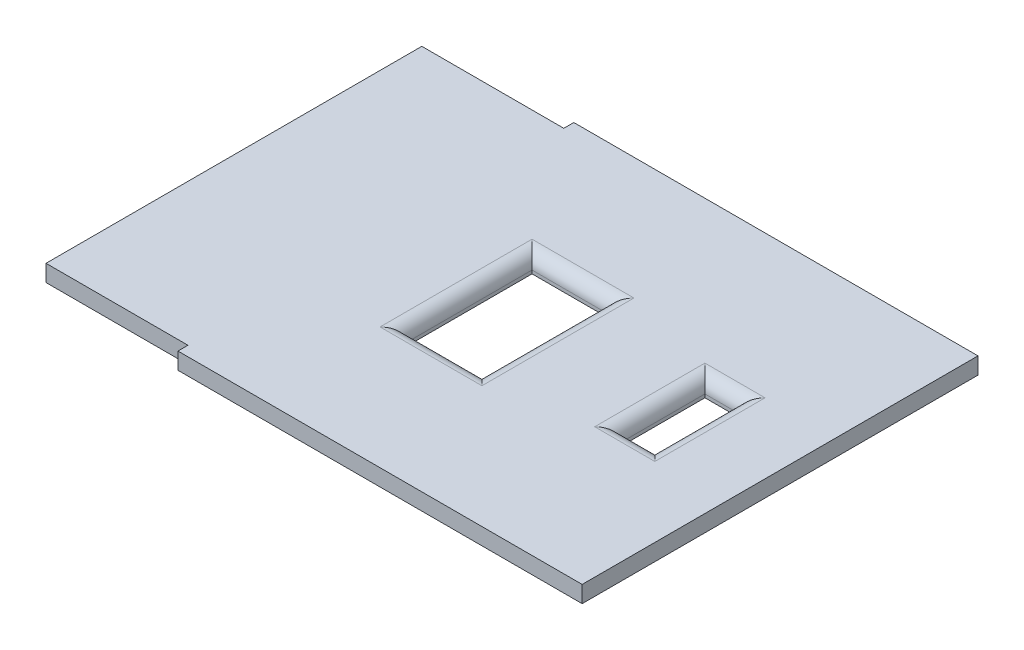
ISO-10303-21;
HEADER;
FILE_DESCRIPTION(('STEP AP214'),'2;1');
FILE_NAME('part.step','',(''),(''),'','','');
FILE_SCHEMA(('AUTOMOTIVE_DESIGN { 1 0 10303 214 1 1 1 1 }'));
ENDSEC;
DATA;
#1=APPLICATION_CONTEXT('core data for automotive mechanical design processes');
#2=APPLICATION_PROTOCOL_DEFINITION('international standard','automotive_design',2000,#1);
#3=PRODUCT_CONTEXT('',#1,'mechanical');
#4=PRODUCT('Part','Part','',(#3));
#5=PRODUCT_RELATED_PRODUCT_CATEGORY('part','',(#4));
#6=PRODUCT_DEFINITION_FORMATION('','',#4);
#7=PRODUCT_DEFINITION_CONTEXT('part definition',#1,'design');
#8=PRODUCT_DEFINITION('design','',#6,#7);
#9=PRODUCT_DEFINITION_SHAPE('','',#8);
#10=(LENGTH_UNIT() NAMED_UNIT(*) SI_UNIT(.MILLI.,.METRE.));
#11=(NAMED_UNIT(*) PLANE_ANGLE_UNIT() SI_UNIT($,.RADIAN.));
#12=(NAMED_UNIT(*) SI_UNIT($,.STERADIAN.) SOLID_ANGLE_UNIT());
#13=UNCERTAINTY_MEASURE_WITH_UNIT(LENGTH_MEASURE(1.E-05),#10,'distance_accuracy_value','');
#14=(GEOMETRIC_REPRESENTATION_CONTEXT(3) GLOBAL_UNCERTAINTY_ASSIGNED_CONTEXT((#13)) GLOBAL_UNIT_ASSIGNED_CONTEXT((#10,
#11,#12)) REPRESENTATION_CONTEXT('',''));
#15=CARTESIAN_POINT('',(0.,0.,0.));
#16=DIRECTION('',(0.,0.,1.));
#17=DIRECTION('',(1.,0.,0.));
#18=AXIS2_PLACEMENT_3D('',#15,#16,#17);
#19=CARTESIAN_POINT('',(21.59,2.54,-28.575));
#20=DIRECTION('',(0.,0.,1.));
#21=DIRECTION('',(1.,0.,0.));
#22=AXIS2_PLACEMENT_3D('',#19,#20,#21);
#23=PLANE('',#22);
#24=DIRECTION('',(-1.,0.,0.));
#25=VECTOR('',#24,1.);
#26=CARTESIAN_POINT('',(21.59,0.,-28.575));
#27=LINE('',#26,#25);
#28=CARTESIAN_POINT('',(21.59,0.,-28.575));
#29=VERTEX_POINT('',#28);
#30=CARTESIAN_POINT('',(0.,0.,-28.575));
#31=VERTEX_POINT('',#30);
#32=EDGE_CURVE('E213',#29,#31,#27,.T.);
#33=ORIENTED_EDGE('',*,*,#32,.T.);
#34=DIRECTION('',(0.,-1.,0.));
#35=VECTOR('',#34,1.);
#36=CARTESIAN_POINT('',(0.,2.54,-28.575));
#37=LINE('',#36,#35);
#38=CARTESIAN_POINT('',(0.,2.54,-28.575));
#39=VERTEX_POINT('',#38);
#40=EDGE_CURVE('E290',#39,#31,#37,.T.);
#41=ORIENTED_EDGE('',*,*,#40,.F.);
#42=DIRECTION('',(-1.,0.,0.));
#43=VECTOR('',#42,1.);
#44=CARTESIAN_POINT('',(21.59,2.54,-28.575));
#45=LINE('',#44,#43);
#46=CARTESIAN_POINT('',(21.59,2.54,-28.575));
#47=VERTEX_POINT('',#46);
#48=EDGE_CURVE('E236',#47,#39,#45,.T.);
#49=ORIENTED_EDGE('',*,*,#48,.F.);
#50=DIRECTION('',(0.,-1.,0.));
#51=VECTOR('',#50,1.);
#52=CARTESIAN_POINT('',(21.59,2.54,-28.575));
#53=LINE('',#52,#51);
#54=EDGE_CURVE('E254',#47,#29,#53,.T.);
#55=ORIENTED_EDGE('',*,*,#54,.T.);
#56=EDGE_LOOP('',(#33,#41,#49,#55));
#57=FACE_BOUND('',#56,.T.);
#58=ADVANCED_FACE('F39',(#57),#23,.F.);
#59=CARTESIAN_POINT('',(0.,2.54,-28.575));
#60=DIRECTION('',(1.,0.,0.));
#61=DIRECTION('',(0.,0.,-1.));
#62=AXIS2_PLACEMENT_3D('',#59,#60,#61);
#63=PLANE('',#62);
#64=DIRECTION('',(0.,0.,1.));
#65=VECTOR('',#64,1.);
#66=CARTESIAN_POINT('',(0.,0.,-28.575));
#67=LINE('',#66,#65);
#68=CARTESIAN_POINT('',(0.,0.,28.575));
#69=VERTEX_POINT('',#68);
#70=EDGE_CURVE('E257',#31,#69,#67,.T.);
#71=ORIENTED_EDGE('',*,*,#70,.T.);
#72=DIRECTION('',(0.,-1.,0.));
#73=VECTOR('',#72,1.);
#74=CARTESIAN_POINT('',(0.,2.54,28.575));
#75=LINE('',#74,#73);
#76=CARTESIAN_POINT('',(0.,2.54,28.575));
#77=VERTEX_POINT('',#76);
#78=EDGE_CURVE('E287',#77,#69,#75,.T.);
#79=ORIENTED_EDGE('',*,*,#78,.F.);
#80=DIRECTION('',(0.,0.,1.));
#81=VECTOR('',#80,1.);
#82=CARTESIAN_POINT('',(0.,2.54,-28.575));
#83=LINE('',#82,#81);
#84=EDGE_CURVE('E239',#39,#77,#83,.T.);
#85=ORIENTED_EDGE('',*,*,#84,.F.);
#86=ORIENTED_EDGE('',*,*,#40,.T.);
#87=EDGE_LOOP('',(#71,#79,#85,#86));
#88=FACE_BOUND('',#87,.T.);
#89=ADVANCED_FACE('F378',(#88),#63,.F.);
#90=CARTESIAN_POINT('',(0.,2.54,28.575));
#91=DIRECTION('',(0.,0.,-1.));
#92=DIRECTION('',(-1.,0.,0.));
#93=AXIS2_PLACEMENT_3D('',#90,#91,#92);
#94=PLANE('',#93);
#95=DIRECTION('',(1.,0.,0.));
#96=VECTOR('',#95,1.);
#97=CARTESIAN_POINT('',(0.,0.,28.575));
#98=LINE('',#97,#96);
#99=CARTESIAN_POINT('',(21.59,0.,28.575));
#100=VERTEX_POINT('',#99);
#101=EDGE_CURVE('E259',#69,#100,#98,.T.);
#102=ORIENTED_EDGE('',*,*,#101,.T.);
#103=DIRECTION('',(0.,-1.,0.));
#104=VECTOR('',#103,1.);
#105=CARTESIAN_POINT('',(21.59,2.54,28.575));
#106=LINE('',#105,#104);
#107=CARTESIAN_POINT('',(21.59,2.54,28.575));
#108=VERTEX_POINT('',#107);
#109=EDGE_CURVE('E284',#108,#100,#106,.T.);
#110=ORIENTED_EDGE('',*,*,#109,.F.);
#111=DIRECTION('',(1.,0.,0.));
#112=VECTOR('',#111,1.);
#113=CARTESIAN_POINT('',(0.,2.54,28.575));
#114=LINE('',#113,#112);
#115=EDGE_CURVE('E242',#77,#108,#114,.T.);
#116=ORIENTED_EDGE('',*,*,#115,.F.);
#117=ORIENTED_EDGE('',*,*,#78,.T.);
#118=EDGE_LOOP('',(#102,#110,#116,#117));
#119=FACE_BOUND('',#118,.T.);
#120=ADVANCED_FACE('F384',(#119),#94,.F.);
#121=CARTESIAN_POINT('',(21.59,2.54,28.575));
#122=DIRECTION('',(1.,0.,0.));
#123=DIRECTION('',(0.,0.,-1.));
#124=AXIS2_PLACEMENT_3D('',#121,#122,#123);
#125=PLANE('',#124);
#126=DIRECTION('',(0.,0.,1.));
#127=VECTOR('',#126,1.);
#128=CARTESIAN_POINT('',(21.59,0.,28.575));
#129=LINE('',#128,#127);
#130=CARTESIAN_POINT('',(21.59,0.,30.099));
#131=VERTEX_POINT('',#130);
#132=EDGE_CURVE('E261',#100,#131,#129,.T.);
#133=ORIENTED_EDGE('',*,*,#132,.T.);
#134=DIRECTION('',(0.,-1.,0.));
#135=VECTOR('',#134,1.);
#136=CARTESIAN_POINT('',(21.59,2.54,30.099));
#137=LINE('',#136,#135);
#138=CARTESIAN_POINT('',(21.59,2.54,30.099));
#139=VERTEX_POINT('',#138);
#140=EDGE_CURVE('E281',#139,#131,#137,.T.);
#141=ORIENTED_EDGE('',*,*,#140,.F.);
#142=DIRECTION('',(0.,0.,1.));
#143=VECTOR('',#142,1.);
#144=CARTESIAN_POINT('',(21.59,2.54,28.575));
#145=LINE('',#144,#143);
#146=EDGE_CURVE('E244',#108,#139,#145,.T.);
#147=ORIENTED_EDGE('',*,*,#146,.F.);
#148=ORIENTED_EDGE('',*,*,#109,.T.);
#149=EDGE_LOOP('',(#133,#141,#147,#148));
#150=FACE_BOUND('',#149,.T.);
#151=ADVANCED_FACE('F547',(#150),#125,.F.);
#152=CARTESIAN_POINT('',(21.59,2.54,30.099));
#153=DIRECTION('',(0.,0.,-1.));
#154=DIRECTION('',(-1.,0.,0.));
#155=AXIS2_PLACEMENT_3D('',#152,#153,#154);
#156=PLANE('',#155);
#157=DIRECTION('',(1.,0.,0.));
#158=VECTOR('',#157,1.);
#159=CARTESIAN_POINT('',(21.59,0.,30.099));
#160=LINE('',#159,#158);
#161=CARTESIAN_POINT('',(83.058,0.,30.099));
#162=VERTEX_POINT('',#161);
#163=EDGE_CURVE('E263',#131,#162,#160,.T.);
#164=ORIENTED_EDGE('',*,*,#163,.T.);
#165=DIRECTION('',(0.,-1.,0.));
#166=VECTOR('',#165,1.);
#167=CARTESIAN_POINT('',(83.058,2.54,30.099));
#168=LINE('',#167,#166);
#169=CARTESIAN_POINT('',(83.058,2.54,30.099));
#170=VERTEX_POINT('',#169);
#171=EDGE_CURVE('E278',#170,#162,#168,.T.);
#172=ORIENTED_EDGE('',*,*,#171,.F.);
#173=DIRECTION('',(1.,0.,0.));
#174=VECTOR('',#173,1.);
#175=CARTESIAN_POINT('',(21.59,2.54,30.099));
#176=LINE('',#175,#174);
#177=EDGE_CURVE('E246',#139,#170,#176,.T.);
#178=ORIENTED_EDGE('',*,*,#177,.F.);
#179=ORIENTED_EDGE('',*,*,#140,.T.);
#180=EDGE_LOOP('',(#164,#172,#178,#179));
#181=FACE_BOUND('',#180,.T.);
#182=ADVANCED_FACE('F537',(#181),#156,.F.);
#183=CARTESIAN_POINT('',(83.058,2.54,30.099));
#184=DIRECTION('',(-1.,0.,0.));
#185=DIRECTION('',(0.,0.,1.));
#186=AXIS2_PLACEMENT_3D('',#183,#184,#185);
#187=PLANE('',#186);
#188=DIRECTION('',(0.,0.,-1.));
#189=VECTOR('',#188,1.);
#190=CARTESIAN_POINT('',(83.058,0.,30.099));
#191=LINE('',#190,#189);
#192=CARTESIAN_POINT('',(83.058,0.,-30.099));
#193=VERTEX_POINT('',#192);
#194=EDGE_CURVE('E265',#162,#193,#191,.T.);
#195=ORIENTED_EDGE('',*,*,#194,.T.);
#196=DIRECTION('',(0.,-1.,0.));
#197=VECTOR('',#196,1.);
#198=CARTESIAN_POINT('',(83.058,2.54,-30.099));
#199=LINE('',#198,#197);
#200=CARTESIAN_POINT('',(83.058,2.54,-30.099));
#201=VERTEX_POINT('',#200);
#202=EDGE_CURVE('E275',#201,#193,#199,.T.);
#203=ORIENTED_EDGE('',*,*,#202,.F.);
#204=DIRECTION('',(0.,0.,-1.));
#205=VECTOR('',#204,1.);
#206=CARTESIAN_POINT('',(83.058,2.54,30.099));
#207=LINE('',#206,#205);
#208=EDGE_CURVE('E248',#170,#201,#207,.T.);
#209=ORIENTED_EDGE('',*,*,#208,.F.);
#210=ORIENTED_EDGE('',*,*,#171,.T.);
#211=EDGE_LOOP('',(#195,#203,#209,#210));
#212=FACE_BOUND('',#211,.T.);
#213=ADVANCED_FACE('F527',(#212),#187,.F.);
#214=CARTESIAN_POINT('',(83.058,2.54,-30.099));
#215=DIRECTION('',(0.,0.,1.));
#216=DIRECTION('',(1.,0.,0.));
#217=AXIS2_PLACEMENT_3D('',#214,#215,#216);
#218=PLANE('',#217);
#219=DIRECTION('',(-1.,0.,0.));
#220=VECTOR('',#219,1.);
#221=CARTESIAN_POINT('',(83.058,0.,-30.099));
#222=LINE('',#221,#220);
#223=CARTESIAN_POINT('',(21.59,0.,-30.099));
#224=VERTEX_POINT('',#223);
#225=EDGE_CURVE('E267',#193,#224,#222,.T.);
#226=ORIENTED_EDGE('',*,*,#225,.T.);
#227=DIRECTION('',(0.,-1.,0.));
#228=VECTOR('',#227,1.);
#229=CARTESIAN_POINT('',(21.59,2.54,-30.099));
#230=LINE('',#229,#228);
#231=CARTESIAN_POINT('',(21.59,2.54,-30.099));
#232=VERTEX_POINT('',#231);
#233=EDGE_CURVE('E272',#232,#224,#230,.T.);
#234=ORIENTED_EDGE('',*,*,#233,.F.);
#235=DIRECTION('',(-1.,0.,0.));
#236=VECTOR('',#235,1.);
#237=CARTESIAN_POINT('',(83.058,2.54,-30.099));
#238=LINE('',#237,#236);
#239=EDGE_CURVE('E250',#201,#232,#238,.T.);
#240=ORIENTED_EDGE('',*,*,#239,.F.);
#241=ORIENTED_EDGE('',*,*,#202,.T.);
#242=EDGE_LOOP('',(#226,#234,#240,#241));
#243=FACE_BOUND('',#242,.T.);
#244=ADVANCED_FACE('F517',(#243),#218,.F.);
#245=CARTESIAN_POINT('',(21.59,2.54,-30.099));
#246=DIRECTION('',(1.,0.,0.));
#247=DIRECTION('',(0.,0.,-1.));
#248=AXIS2_PLACEMENT_3D('',#245,#246,#247);
#249=PLANE('',#248);
#250=DIRECTION('',(0.,0.,1.));
#251=VECTOR('',#250,1.);
#252=CARTESIAN_POINT('',(21.59,0.,-30.099));
#253=LINE('',#252,#251);
#254=EDGE_CURVE('E240',#224,#29,#253,.T.);
#255=ORIENTED_EDGE('',*,*,#254,.T.);
#256=ORIENTED_EDGE('',*,*,#54,.F.);
#257=DIRECTION('',(0.,0.,1.));
#258=VECTOR('',#257,1.);
#259=CARTESIAN_POINT('',(21.59,2.54,-30.099));
#260=LINE('',#259,#258);
#261=EDGE_CURVE('E252',#232,#47,#260,.T.);
#262=ORIENTED_EDGE('',*,*,#261,.F.);
#263=ORIENTED_EDGE('',*,*,#233,.T.);
#264=EDGE_LOOP('',(#255,#256,#262,#263));
#265=FACE_BOUND('',#264,.T.);
#266=ADVANCED_FACE('F508',(#265),#249,.F.);
#267=CARTESIAN_POINT('',(0.,2.54,0.));
#268=DIRECTION('',(0.,1.,0.));
#269=DIRECTION('',(0.,0.,1.));
#270=AXIS2_PLACEMENT_3D('',#267,#268,#269);
#271=PLANE('',#270);
#272=DIRECTION('',(-1.,0.,0.));
#273=VECTOR('',#272,1.);
#274=CARTESIAN_POINT('',(47.244,2.54,-11.557));
#275=LINE('',#274,#273);
#276=CARTESIAN_POINT('',(33.782,2.54,-11.557));
#277=VERTEX_POINT('',#276);
#278=CARTESIAN_POINT('',(49.276,2.54,-11.557));
#279=VERTEX_POINT('',#278);
#280=EDGE_CURVE('E303',#277,#279,#275,.F.);
#281=ORIENTED_EDGE('',*,*,#280,.T.);
#282=DIRECTION('',(0.,0.,-1.));
#283=VECTOR('',#282,1.);
#284=CARTESIAN_POINT('',(49.276,2.54,9.52500000000001));
#285=LINE('',#284,#283);
#286=CARTESIAN_POINT('',(49.276,2.54,11.557));
#287=VERTEX_POINT('',#286);
#288=EDGE_CURVE('E309',#279,#287,#285,.F.);
#289=ORIENTED_EDGE('',*,*,#288,.T.);
#290=DIRECTION('',(1.,0.,0.));
#291=VECTOR('',#290,1.);
#292=CARTESIAN_POINT('',(35.814,2.54,11.557));
#293=LINE('',#292,#291);
#294=CARTESIAN_POINT('',(33.782,2.54,11.557));
#295=VERTEX_POINT('',#294);
#296=EDGE_CURVE('E307',#287,#295,#293,.F.);
#297=ORIENTED_EDGE('',*,*,#296,.T.);
#298=DIRECTION('',(0.,0.,1.));
#299=VECTOR('',#298,1.);
#300=CARTESIAN_POINT('',(33.782,2.54,-9.525));
#301=LINE('',#300,#299);
#302=EDGE_CURVE('E305',#295,#277,#301,.F.);
#303=ORIENTED_EDGE('',*,*,#302,.T.);
#304=EDGE_LOOP('',(#281,#289,#297,#303));
#305=FACE_BOUND('',#304,.T.);
#306=DIRECTION('',(-1.,0.,0.));
#307=VECTOR('',#306,1.);
#308=CARTESIAN_POINT('',(70.358,2.54,-8.38199999999999));
#309=LINE('',#308,#307);
#310=CARTESIAN_POINT('',(63.246,2.54,-8.38199999999999));
#311=VERTEX_POINT('',#310);
#312=CARTESIAN_POINT('',(72.39,2.54,-8.38199999999999));
#313=VERTEX_POINT('',#312);
#314=EDGE_CURVE('E294',#311,#313,#309,.F.);
#315=ORIENTED_EDGE('',*,*,#314,.T.);
#316=DIRECTION('',(0.,0.,-1.));
#317=VECTOR('',#316,1.);
#318=CARTESIAN_POINT('',(72.39,2.54,6.35000000000001));
#319=LINE('',#318,#317);
#320=CARTESIAN_POINT('',(72.39,2.54,8.38200000000001));
#321=VERTEX_POINT('',#320);
#322=EDGE_CURVE('E300',#313,#321,#319,.F.);
#323=ORIENTED_EDGE('',*,*,#322,.T.);
#324=DIRECTION('',(1.,0.,0.));
#325=VECTOR('',#324,1.);
#326=CARTESIAN_POINT('',(65.278,2.54,8.38200000000001));
#327=LINE('',#326,#325);
#328=CARTESIAN_POINT('',(63.246,2.54,8.38200000000001));
#329=VERTEX_POINT('',#328);
#330=EDGE_CURVE('E298',#321,#329,#327,.F.);
#331=ORIENTED_EDGE('',*,*,#330,.T.);
#332=DIRECTION('',(0.,0.,1.));
#333=VECTOR('',#332,1.);
#334=CARTESIAN_POINT('',(63.246,2.54,-6.34999999999999));
#335=LINE('',#334,#333);
#336=EDGE_CURVE('E296',#329,#311,#335,.F.);
#337=ORIENTED_EDGE('',*,*,#336,.T.);
#338=EDGE_LOOP('',(#315,#323,#331,#337));
#339=FACE_BOUND('',#338,.T.);
#340=ORIENTED_EDGE('',*,*,#48,.T.);
#341=ORIENTED_EDGE('',*,*,#84,.T.);
#342=ORIENTED_EDGE('',*,*,#115,.T.);
#343=ORIENTED_EDGE('',*,*,#146,.T.);
#344=ORIENTED_EDGE('',*,*,#177,.T.);
#345=ORIENTED_EDGE('',*,*,#208,.T.);
#346=ORIENTED_EDGE('',*,*,#239,.T.);
#347=ORIENTED_EDGE('',*,*,#261,.T.);
#348=EDGE_LOOP('',(#340,#341,#342,#343,#344,#345,#346,#347));
#349=FACE_BOUND('',#348,.T.);
#350=ADVANCED_FACE('F351',(#305,#339,#349),#271,.T.);
#351=CARTESIAN_POINT('',(0.,0.,0.));
#352=DIRECTION('',(0.,1.,0.));
#353=DIRECTION('',(0.,0.,1.));
#354=AXIS2_PLACEMENT_3D('',#351,#352,#353);
#355=PLANE('',#354);
#356=DIRECTION('',(1.,0.,0.));
#357=VECTOR('',#356,1.);
#358=CARTESIAN_POINT('',(35.814,0.,9.52500000000001));
#359=LINE('',#358,#357);
#360=CARTESIAN_POINT('',(35.814,0.,9.52500000000001));
#361=VERTEX_POINT('',#360);
#362=CARTESIAN_POINT('',(47.244,0.,9.52500000000001));
#363=VERTEX_POINT('',#362);
#364=EDGE_CURVE('E189',#361,#363,#359,.T.);
#365=ORIENTED_EDGE('',*,*,#364,.T.);
#366=DIRECTION('',(0.,0.,-1.));
#367=VECTOR('',#366,1.);
#368=CARTESIAN_POINT('',(47.244,0.,9.52500000000001));
#369=LINE('',#368,#367);
#370=CARTESIAN_POINT('',(47.244,0.,-9.525));
#371=VERTEX_POINT('',#370);
#372=EDGE_CURVE('E183',#363,#371,#369,.T.);
#373=ORIENTED_EDGE('',*,*,#372,.T.);
#374=DIRECTION('',(-1.,0.,0.));
#375=VECTOR('',#374,1.);
#376=CARTESIAN_POINT('',(35.814,0.,-9.525));
#377=LINE('',#376,#375);
#378=CARTESIAN_POINT('',(35.814,0.,-9.525));
#379=VERTEX_POINT('',#378);
#380=EDGE_CURVE('E193',#371,#379,#377,.T.);
#381=ORIENTED_EDGE('',*,*,#380,.T.);
#382=DIRECTION('',(0.,0.,1.));
#383=VECTOR('',#382,1.);
#384=CARTESIAN_POINT('',(35.814,0.,9.52500000000001));
#385=LINE('',#384,#383);
#386=EDGE_CURVE('E198',#379,#361,#385,.T.);
#387=ORIENTED_EDGE('',*,*,#386,.T.);
#388=EDGE_LOOP('',(#365,#373,#381,#387));
#389=FACE_BOUND('',#388,.T.);
#390=DIRECTION('',(1.,0.,0.));
#391=VECTOR('',#390,1.);
#392=CARTESIAN_POINT('',(65.278,0.,6.35000000000001));
#393=LINE('',#392,#391);
#394=CARTESIAN_POINT('',(65.278,0.,6.35000000000001));
#395=VERTEX_POINT('',#394);
#396=CARTESIAN_POINT('',(70.358,0.,6.35000000000001));
#397=VERTEX_POINT('',#396);
#398=EDGE_CURVE('E220',#395,#397,#393,.T.);
#399=ORIENTED_EDGE('',*,*,#398,.T.);
#400=DIRECTION('',(0.,0.,-1.));
#401=VECTOR('',#400,1.);
#402=CARTESIAN_POINT('',(70.358,0.,6.35000000000001));
#403=LINE('',#402,#401);
#404=CARTESIAN_POINT('',(70.358,0.,-6.34999999999999));
#405=VERTEX_POINT('',#404);
#406=EDGE_CURVE('E203',#397,#405,#403,.T.);
#407=ORIENTED_EDGE('',*,*,#406,.T.);
#408=DIRECTION('',(-1.,0.,0.));
#409=VECTOR('',#408,1.);
#410=CARTESIAN_POINT('',(65.278,0.,-6.34999999999999));
#411=LINE('',#410,#409);
#412=CARTESIAN_POINT('',(65.278,0.,-6.34999999999999));
#413=VERTEX_POINT('',#412);
#414=EDGE_CURVE('E206',#405,#413,#411,.T.);
#415=ORIENTED_EDGE('',*,*,#414,.T.);
#416=DIRECTION('',(0.,0.,1.));
#417=VECTOR('',#416,1.);
#418=CARTESIAN_POINT('',(65.278,0.,6.35000000000001));
#419=LINE('',#418,#417);
#420=EDGE_CURVE('E231',#413,#395,#419,.T.);
#421=ORIENTED_EDGE('',*,*,#420,.T.);
#422=EDGE_LOOP('',(#399,#407,#415,#421));
#423=FACE_BOUND('',#422,.T.);
#424=ORIENTED_EDGE('',*,*,#32,.F.);
#425=ORIENTED_EDGE('',*,*,#254,.F.);
#426=ORIENTED_EDGE('',*,*,#225,.F.);
#427=ORIENTED_EDGE('',*,*,#194,.F.);
#428=ORIENTED_EDGE('',*,*,#163,.F.);
#429=ORIENTED_EDGE('',*,*,#132,.F.);
#430=ORIENTED_EDGE('',*,*,#101,.F.);
#431=ORIENTED_EDGE('',*,*,#70,.F.);
#432=EDGE_LOOP('',(#424,#425,#426,#427,#428,#429,#430,#431));
#433=FACE_BOUND('',#432,.T.);
#434=ADVANCED_FACE('F200',(#389,#423,#433),#355,.F.);
#435=CARTESIAN_POINT('',(70.358,0.,6.35000000000001));
#436=DIRECTION('',(1.,0.,0.));
#437=DIRECTION('',(0.,0.,-1.));
#438=AXIS2_PLACEMENT_3D('',#435,#436,#437);
#439=PLANE('',#438);
#440=DIRECTION('',(0.,1.,0.));
#441=VECTOR('',#440,1.);
#442=CARTESIAN_POINT('',(70.358,0.,6.35000000000001));
#443=LINE('',#442,#441);
#444=CARTESIAN_POINT('',(70.358,0.508,6.35000000000001));
#445=VERTEX_POINT('',#444);
#446=EDGE_CURVE('E225',#397,#445,#443,.T.);
#447=ORIENTED_EDGE('',*,*,#446,.T.);
#448=DIRECTION('',(0.,0.,-1.));
#449=VECTOR('',#448,1.);
#450=CARTESIAN_POINT('',(70.358,0.508,-6.34999999999999));
#451=LINE('',#450,#449);
#452=CARTESIAN_POINT('',(70.358,0.508,-6.34999999999999));
#453=VERTEX_POINT('',#452);
#454=EDGE_CURVE('E318',#445,#453,#451,.T.);
#455=ORIENTED_EDGE('',*,*,#454,.T.);
#456=DIRECTION('',(0.,1.,0.));
#457=VECTOR('',#456,1.);
#458=CARTESIAN_POINT('',(70.358,0.,-6.34999999999999));
#459=LINE('',#458,#457);
#460=EDGE_CURVE('E218',#405,#453,#459,.T.);
#461=ORIENTED_EDGE('',*,*,#460,.F.);
#462=ORIENTED_EDGE('',*,*,#406,.F.);
#463=EDGE_LOOP('',(#447,#455,#461,#462));
#464=FACE_BOUND('',#463,.T.);
#465=ADVANCED_FACE('F360',(#464),#439,.F.);
#466=CARTESIAN_POINT('',(65.278,0.,6.35000000000001));
#467=DIRECTION('',(0.,0.,1.));
#468=DIRECTION('',(1.,0.,0.));
#469=AXIS2_PLACEMENT_3D('',#466,#467,#468);
#470=PLANE('',#469);
#471=DIRECTION('',(0.,1.,0.));
#472=VECTOR('',#471,1.);
#473=CARTESIAN_POINT('',(65.278,0.,6.35000000000001));
#474=LINE('',#473,#472);
#475=CARTESIAN_POINT('',(65.278,0.508,6.35000000000001));
#476=VERTEX_POINT('',#475);
#477=EDGE_CURVE('E223',#395,#476,#474,.T.);
#478=ORIENTED_EDGE('',*,*,#477,.T.);
#479=DIRECTION('',(1.,0.,0.));
#480=VECTOR('',#479,1.);
#481=CARTESIAN_POINT('',(70.358,0.508,6.35000000000001));
#482=LINE('',#481,#480);
#483=EDGE_CURVE('E321',#476,#445,#482,.T.);
#484=ORIENTED_EDGE('',*,*,#483,.T.);
#485=ORIENTED_EDGE('',*,*,#446,.F.);
#486=ORIENTED_EDGE('',*,*,#398,.F.);
#487=EDGE_LOOP('',(#478,#484,#485,#486));
#488=FACE_BOUND('',#487,.T.);
#489=ADVANCED_FACE('F367',(#488),#470,.F.);
#490=CARTESIAN_POINT('',(65.278,0.,6.35000000000001));
#491=DIRECTION('',(-1.,0.,0.));
#492=DIRECTION('',(0.,0.,1.));
#493=AXIS2_PLACEMENT_3D('',#490,#491,#492);
#494=PLANE('',#493);
#495=DIRECTION('',(0.,1.,0.));
#496=VECTOR('',#495,1.);
#497=CARTESIAN_POINT('',(65.278,0.,-6.34999999999999));
#498=LINE('',#497,#496);
#499=CARTESIAN_POINT('',(65.278,0.508,-6.34999999999999));
#500=VERTEX_POINT('',#499);
#501=EDGE_CURVE('E221',#413,#500,#498,.T.);
#502=ORIENTED_EDGE('',*,*,#501,.T.);
#503=DIRECTION('',(0.,0.,1.));
#504=VECTOR('',#503,1.);
#505=CARTESIAN_POINT('',(65.278,0.508,6.35000000000001));
#506=LINE('',#505,#504);
#507=EDGE_CURVE('E48',#500,#476,#506,.T.);
#508=ORIENTED_EDGE('',*,*,#507,.T.);
#509=ORIENTED_EDGE('',*,*,#477,.F.);
#510=ORIENTED_EDGE('',*,*,#420,.F.);
#511=EDGE_LOOP('',(#502,#508,#509,#510));
#512=FACE_BOUND('',#511,.T.);
#513=ADVANCED_FACE('F368',(#512),#494,.F.);
#514=CARTESIAN_POINT('',(65.278,0.,-6.34999999999999));
#515=DIRECTION('',(0.,0.,-1.));
#516=DIRECTION('',(-1.,0.,0.));
#517=AXIS2_PLACEMENT_3D('',#514,#515,#516);
#518=PLANE('',#517);
#519=ORIENTED_EDGE('',*,*,#460,.T.);
#520=DIRECTION('',(-1.,0.,0.));
#521=VECTOR('',#520,1.);
#522=CARTESIAN_POINT('',(65.278,0.508,-6.34999999999999));
#523=LINE('',#522,#521);
#524=EDGE_CURVE('E11',#453,#500,#523,.T.);
#525=ORIENTED_EDGE('',*,*,#524,.T.);
#526=ORIENTED_EDGE('',*,*,#501,.F.);
#527=ORIENTED_EDGE('',*,*,#414,.F.);
#528=EDGE_LOOP('',(#519,#525,#526,#527));
#529=FACE_BOUND('',#528,.T.);
#530=ADVANCED_FACE('F363',(#529),#518,.F.);
#531=CARTESIAN_POINT('',(47.244,0.,9.52500000000001));
#532=DIRECTION('',(1.,0.,0.));
#533=DIRECTION('',(0.,0.,-1.));
#534=AXIS2_PLACEMENT_3D('',#531,#532,#533);
#535=PLANE('',#534);
#536=DIRECTION('',(0.,1.,0.));
#537=VECTOR('',#536,1.);
#538=CARTESIAN_POINT('',(47.244,0.,9.52500000000001));
#539=LINE('',#538,#537);
#540=CARTESIAN_POINT('',(47.244,0.508,9.52500000000001));
#541=VERTEX_POINT('',#540);
#542=EDGE_CURVE('E211',#363,#541,#539,.T.);
#543=ORIENTED_EDGE('',*,*,#542,.T.);
#544=DIRECTION('',(0.,0.,-1.));
#545=VECTOR('',#544,1.);
#546=CARTESIAN_POINT('',(47.244,0.508,-9.525));
#547=LINE('',#546,#545);
#548=CARTESIAN_POINT('',(47.244,0.508,-9.525));
#549=VERTEX_POINT('',#548);
#550=EDGE_CURVE('E186',#541,#549,#547,.T.);
#551=ORIENTED_EDGE('',*,*,#550,.T.);
#552=DIRECTION('',(0.,1.,0.));
#553=VECTOR('',#552,1.);
#554=CARTESIAN_POINT('',(47.244,0.,-9.525));
#555=LINE('',#554,#553);
#556=EDGE_CURVE('E178',#371,#549,#555,.T.);
#557=ORIENTED_EDGE('',*,*,#556,.F.);
#558=ORIENTED_EDGE('',*,*,#372,.F.);
#559=EDGE_LOOP('',(#543,#551,#557,#558));
#560=FACE_BOUND('',#559,.T.);
#561=ADVANCED_FACE('F181',(#560),#535,.F.);
#562=CARTESIAN_POINT('',(35.814,0.,9.52500000000001));
#563=DIRECTION('',(0.,0.,1.));
#564=DIRECTION('',(1.,0.,0.));
#565=AXIS2_PLACEMENT_3D('',#562,#563,#564);
#566=PLANE('',#565);
#567=DIRECTION('',(0.,1.,0.));
#568=VECTOR('',#567,1.);
#569=CARTESIAN_POINT('',(35.814,0.,9.52500000000001));
#570=LINE('',#569,#568);
#571=CARTESIAN_POINT('',(35.814,0.508,9.52500000000001));
#572=VERTEX_POINT('',#571);
#573=EDGE_CURVE('E214',#361,#572,#570,.T.);
#574=ORIENTED_EDGE('',*,*,#573,.T.);
#575=DIRECTION('',(1.,0.,0.));
#576=VECTOR('',#575,1.);
#577=CARTESIAN_POINT('',(47.244,0.508,9.52500000000001));
#578=LINE('',#577,#576);
#579=EDGE_CURVE('E312',#572,#541,#578,.T.);
#580=ORIENTED_EDGE('',*,*,#579,.T.);
#581=ORIENTED_EDGE('',*,*,#542,.F.);
#582=ORIENTED_EDGE('',*,*,#364,.F.);
#583=EDGE_LOOP('',(#574,#580,#581,#582));
#584=FACE_BOUND('',#583,.T.);
#585=ADVANCED_FACE('F449',(#584),#566,.F.);
#586=CARTESIAN_POINT('',(35.814,0.,9.52500000000001));
#587=DIRECTION('',(-1.,0.,0.));
#588=DIRECTION('',(0.,0.,1.));
#589=AXIS2_PLACEMENT_3D('',#586,#587,#588);
#590=PLANE('',#589);
#591=DIRECTION('',(0.,1.,0.));
#592=VECTOR('',#591,1.);
#593=CARTESIAN_POINT('',(35.814,0.,-9.525));
#594=LINE('',#593,#592);
#595=CARTESIAN_POINT('',(35.814,0.508,-9.525));
#596=VERTEX_POINT('',#595);
#597=EDGE_CURVE('E188',#379,#596,#594,.T.);
#598=ORIENTED_EDGE('',*,*,#597,.T.);
#599=DIRECTION('',(0.,0.,1.));
#600=VECTOR('',#599,1.);
#601=CARTESIAN_POINT('',(35.814,0.508,9.52500000000001));
#602=LINE('',#601,#600);
#603=EDGE_CURVE('E314',#596,#572,#602,.T.);
#604=ORIENTED_EDGE('',*,*,#603,.T.);
#605=ORIENTED_EDGE('',*,*,#573,.F.);
#606=ORIENTED_EDGE('',*,*,#386,.F.);
#607=EDGE_LOOP('',(#598,#604,#605,#606));
#608=FACE_BOUND('',#607,.T.);
#609=ADVANCED_FACE('F441',(#608),#590,.F.);
#610=CARTESIAN_POINT('',(35.814,0.,-9.525));
#611=DIRECTION('',(0.,0.,-1.));
#612=DIRECTION('',(-1.,0.,0.));
#613=AXIS2_PLACEMENT_3D('',#610,#611,#612);
#614=PLANE('',#613);
#615=ORIENTED_EDGE('',*,*,#556,.T.);
#616=DIRECTION('',(-1.,0.,0.));
#617=VECTOR('',#616,1.);
#618=CARTESIAN_POINT('',(35.814,0.508,-9.525));
#619=LINE('',#618,#617);
#620=EDGE_CURVE('E316',#549,#596,#619,.T.);
#621=ORIENTED_EDGE('',*,*,#620,.T.);
#622=ORIENTED_EDGE('',*,*,#597,.F.);
#623=ORIENTED_EDGE('',*,*,#380,.F.);
#624=EDGE_LOOP('',(#615,#621,#622,#623));
#625=FACE_BOUND('',#624,.T.);
#626=ADVANCED_FACE('F194',(#625),#614,.F.);
#627=CARTESIAN_POINT('',(33.782,0.508,9.52500000000001));
#628=DIRECTION('',(0.,0.,-1.));
#629=DIRECTION('',(-1.,0.,0.));
#630=AXIS2_PLACEMENT_3D('',#627,#628,#629);
#631=CYLINDRICAL_SURFACE('',#630,2.032);
#632=CARTESIAN_POINT('',(33.782,0.508,-11.557));
#633=DIRECTION('',(0.707106781186547,0.,-0.707106781186547));
#634=DIRECTION('',(-0.707106781186547,0.,-0.707106781186547));
#635=AXIS2_PLACEMENT_3D('',#632,#633,#634);
#636=ELLIPSE('',#635,2.87368195874213,2.032);
#637=EDGE_CURVE('E328',#277,#596,#636,.T.);
#638=ORIENTED_EDGE('',*,*,#637,.F.);
#639=ORIENTED_EDGE('',*,*,#302,.F.);
#640=CARTESIAN_POINT('',(33.782,0.508,11.557));
#641=DIRECTION('',(-0.707106781186547,0.,-0.707106781186547));
#642=DIRECTION('',(-0.707106781186547,0.,0.707106781186547));
#643=AXIS2_PLACEMENT_3D('',#640,#641,#642);
#644=ELLIPSE('',#643,2.87368195874213,2.032);
#645=EDGE_CURVE('E228',#572,#295,#644,.F.);
#646=ORIENTED_EDGE('',*,*,#645,.F.);
#647=ORIENTED_EDGE('',*,*,#603,.F.);
#648=EDGE_LOOP('',(#638,#639,#646,#647));
#649=FACE_BOUND('',#648,.T.);
#650=ADVANCED_FACE('F400',(#649),#631,.T.);
#651=CARTESIAN_POINT('',(35.814,0.508,11.557));
#652=DIRECTION('',(-1.,0.,0.));
#653=DIRECTION('',(0.,0.,1.));
#654=AXIS2_PLACEMENT_3D('',#651,#652,#653);
#655=CYLINDRICAL_SURFACE('',#654,2.032);
#656=ORIENTED_EDGE('',*,*,#645,.T.);
#657=ORIENTED_EDGE('',*,*,#296,.F.);
#658=CARTESIAN_POINT('',(49.276,0.508,11.557));
#659=DIRECTION('',(-0.707106781186547,0.,0.707106781186547));
#660=DIRECTION('',(0.707106781186547,0.,0.707106781186547));
#661=AXIS2_PLACEMENT_3D('',#658,#659,#660);
#662=ELLIPSE('',#661,2.87368195874213,2.032);
#663=EDGE_CURVE('E326',#541,#287,#662,.F.);
#664=ORIENTED_EDGE('',*,*,#663,.F.);
#665=ORIENTED_EDGE('',*,*,#579,.F.);
#666=EDGE_LOOP('',(#656,#657,#664,#665));
#667=FACE_BOUND('',#666,.T.);
#668=ADVANCED_FACE('F396',(#667),#655,.T.);
#669=CARTESIAN_POINT('',(35.814,0.508,-11.557));
#670=DIRECTION('',(1.,0.,0.));
#671=DIRECTION('',(0.,0.,-1.));
#672=AXIS2_PLACEMENT_3D('',#669,#670,#671);
#673=CYLINDRICAL_SURFACE('',#672,2.032);
#674=ORIENTED_EDGE('',*,*,#637,.T.);
#675=ORIENTED_EDGE('',*,*,#620,.F.);
#676=CARTESIAN_POINT('',(49.276,0.508,-11.557));
#677=DIRECTION('',(0.707106781186547,0.,0.707106781186547));
#678=DIRECTION('',(-0.707106781186547,0.,0.707106781186547));
#679=AXIS2_PLACEMENT_3D('',#676,#677,#678);
#680=ELLIPSE('',#679,2.87368195874213,2.032);
#681=EDGE_CURVE('E324',#279,#549,#680,.T.);
#682=ORIENTED_EDGE('',*,*,#681,.F.);
#683=ORIENTED_EDGE('',*,*,#280,.F.);
#684=EDGE_LOOP('',(#674,#675,#682,#683));
#685=FACE_BOUND('',#684,.T.);
#686=ADVANCED_FACE('F392',(#685),#673,.T.);
#687=CARTESIAN_POINT('',(49.276,0.508,9.52500000000001));
#688=DIRECTION('',(0.,0.,1.));
#689=DIRECTION('',(1.,0.,0.));
#690=AXIS2_PLACEMENT_3D('',#687,#688,#689);
#691=CYLINDRICAL_SURFACE('',#690,2.032);
#692=ORIENTED_EDGE('',*,*,#663,.T.);
#693=ORIENTED_EDGE('',*,*,#288,.F.);
#694=ORIENTED_EDGE('',*,*,#681,.T.);
#695=ORIENTED_EDGE('',*,*,#550,.F.);
#696=EDGE_LOOP('',(#692,#693,#694,#695));
#697=FACE_BOUND('',#696,.T.);
#698=ADVANCED_FACE('F389',(#697),#691,.T.);
#699=CARTESIAN_POINT('',(63.246,0.508,6.35000000000001));
#700=DIRECTION('',(0.,0.,-1.));
#701=DIRECTION('',(-1.,0.,0.));
#702=AXIS2_PLACEMENT_3D('',#699,#700,#701);
#703=CYLINDRICAL_SURFACE('',#702,2.032);
#704=CARTESIAN_POINT('',(63.246,0.508,-8.38199999999999));
#705=DIRECTION('',(0.707106781186547,0.,-0.707106781186547));
#706=DIRECTION('',(-0.707106781186547,0.,-0.707106781186547));
#707=AXIS2_PLACEMENT_3D('',#704,#705,#706);
#708=ELLIPSE('',#707,2.87368195874213,2.032);
#709=EDGE_CURVE('E336',#311,#500,#708,.T.);
#710=ORIENTED_EDGE('',*,*,#709,.F.);
#711=ORIENTED_EDGE('',*,*,#336,.F.);
#712=CARTESIAN_POINT('',(63.246,0.508,8.38200000000001));
#713=DIRECTION('',(-0.707106781186547,0.,-0.707106781186547));
#714=DIRECTION('',(-0.707106781186547,0.,0.707106781186547));
#715=AXIS2_PLACEMENT_3D('',#712,#713,#714);
#716=ELLIPSE('',#715,2.87368195874213,2.032);
#717=EDGE_CURVE('E43',#476,#329,#716,.F.);
#718=ORIENTED_EDGE('',*,*,#717,.F.);
#719=ORIENTED_EDGE('',*,*,#507,.F.);
#720=EDGE_LOOP('',(#710,#711,#718,#719));
#721=FACE_BOUND('',#720,.T.);
#722=ADVANCED_FACE('F41',(#721),#703,.T.);
#723=CARTESIAN_POINT('',(65.278,0.508,8.38200000000001));
#724=DIRECTION('',(-1.,0.,0.));
#725=DIRECTION('',(0.,0.,1.));
#726=AXIS2_PLACEMENT_3D('',#723,#724,#725);
#727=CYLINDRICAL_SURFACE('',#726,2.032);
#728=ORIENTED_EDGE('',*,*,#717,.T.);
#729=ORIENTED_EDGE('',*,*,#330,.F.);
#730=CARTESIAN_POINT('',(72.39,0.508,8.38200000000001));
#731=DIRECTION('',(-0.707106781186547,0.,0.707106781186547));
#732=DIRECTION('',(0.707106781186547,0.,0.707106781186547));
#733=AXIS2_PLACEMENT_3D('',#730,#731,#732);
#734=ELLIPSE('',#733,2.87368195874213,2.032);
#735=EDGE_CURVE('E335',#445,#321,#734,.F.);
#736=ORIENTED_EDGE('',*,*,#735,.F.);
#737=ORIENTED_EDGE('',*,*,#483,.F.);
#738=EDGE_LOOP('',(#728,#729,#736,#737));
#739=FACE_BOUND('',#738,.T.);
#740=ADVANCED_FACE('F346',(#739),#727,.T.);
#741=CARTESIAN_POINT('',(65.278,0.508,-8.38199999999999));
#742=DIRECTION('',(1.,0.,0.));
#743=DIRECTION('',(0.,0.,-1.));
#744=AXIS2_PLACEMENT_3D('',#741,#742,#743);
#745=CYLINDRICAL_SURFACE('',#744,2.032);
#746=ORIENTED_EDGE('',*,*,#709,.T.);
#747=ORIENTED_EDGE('',*,*,#524,.F.);
#748=CARTESIAN_POINT('',(72.39,0.508,-8.38199999999999));
#749=DIRECTION('',(0.707106781186547,0.,0.707106781186547));
#750=DIRECTION('',(-0.707106781186547,0.,0.707106781186547));
#751=AXIS2_PLACEMENT_3D('',#748,#749,#750);
#752=ELLIPSE('',#751,2.87368195874213,2.032);
#753=EDGE_CURVE('E333',#313,#453,#752,.T.);
#754=ORIENTED_EDGE('',*,*,#753,.F.);
#755=ORIENTED_EDGE('',*,*,#314,.F.);
#756=EDGE_LOOP('',(#746,#747,#754,#755));
#757=FACE_BOUND('',#756,.T.);
#758=ADVANCED_FACE('F358',(#757),#745,.T.);
#759=CARTESIAN_POINT('',(72.39,0.508,6.35000000000001));
#760=DIRECTION('',(0.,0.,1.));
#761=DIRECTION('',(1.,0.,0.));
#762=AXIS2_PLACEMENT_3D('',#759,#760,#761);
#763=CYLINDRICAL_SURFACE('',#762,2.032);
#764=ORIENTED_EDGE('',*,*,#735,.T.);
#765=ORIENTED_EDGE('',*,*,#322,.F.);
#766=ORIENTED_EDGE('',*,*,#753,.T.);
#767=ORIENTED_EDGE('',*,*,#454,.F.);
#768=EDGE_LOOP('',(#764,#765,#766,#767));
#769=FACE_BOUND('',#768,.T.);
#770=ADVANCED_FACE('F356',(#769),#763,.T.);
#771=CLOSED_SHELL('',(#58,#89,#120,#151,#182,#213,#244,#266,#350,#434,#465,#489,#513,#530,#561,
#585,#609,#626,#650,#668,#686,#698,#722,#740,#758,#770));
#772=MANIFOLD_SOLID_BREP('B2',#771);
#773=ADVANCED_BREP_SHAPE_REPRESENTATION('',(#18,#772),#14);
#774=SHAPE_DEFINITION_REPRESENTATION(#9,#773);
ENDSEC;
END-ISO-10303-21;
